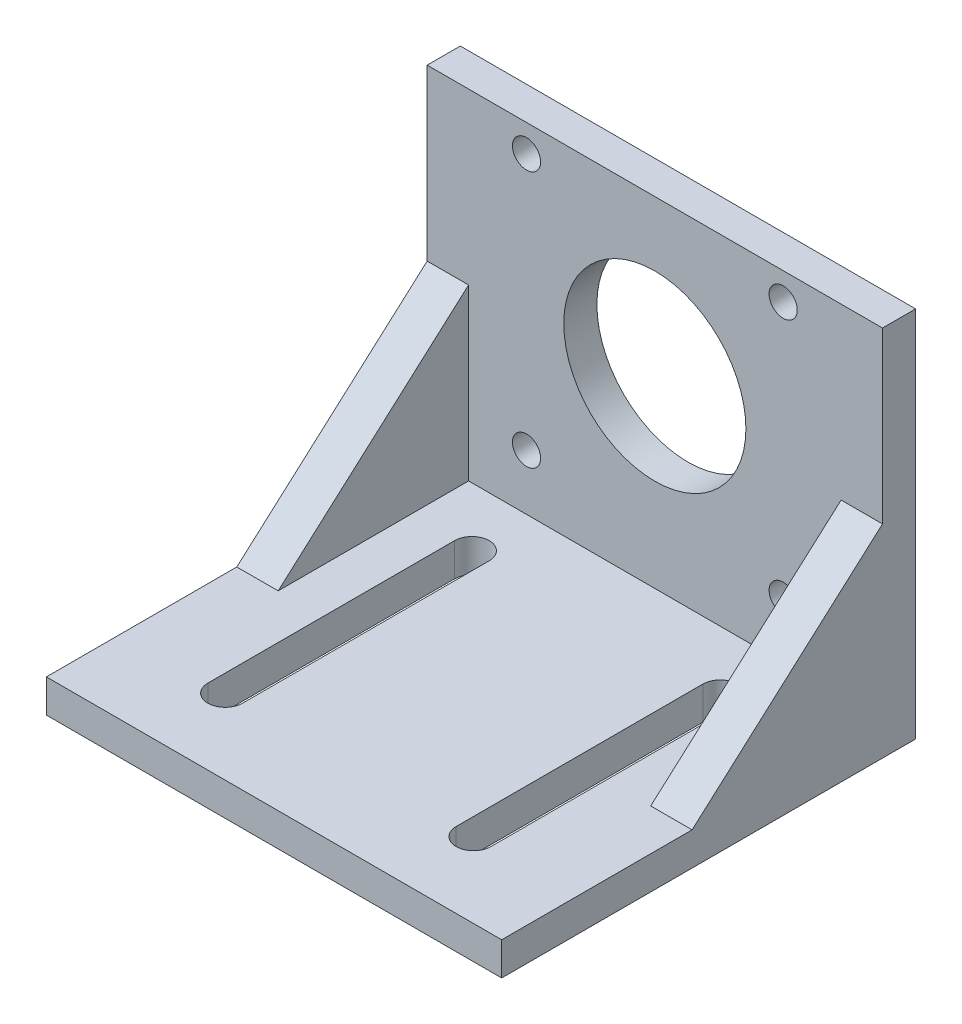
ISO-10303-21;
HEADER;
FILE_DESCRIPTION(('STEP AP214'),'2;1');
FILE_NAME('part.step','',(''),(''),'','','');
FILE_SCHEMA(('AUTOMOTIVE_DESIGN { 1 0 10303 214 1 1 1 1 }'));
ENDSEC;
DATA;
#1=APPLICATION_CONTEXT('core data for automotive mechanical design processes');
#2=APPLICATION_PROTOCOL_DEFINITION('international standard','automotive_design',2000,#1);
#3=PRODUCT_CONTEXT('',#1,'mechanical');
#4=PRODUCT('Part','Part','',(#3));
#5=PRODUCT_RELATED_PRODUCT_CATEGORY('part','',(#4));
#6=PRODUCT_DEFINITION_FORMATION('','',#4);
#7=PRODUCT_DEFINITION_CONTEXT('part definition',#1,'design');
#8=PRODUCT_DEFINITION('design','',#6,#7);
#9=PRODUCT_DEFINITION_SHAPE('','',#8);
#10=(LENGTH_UNIT() NAMED_UNIT(*) SI_UNIT(.MILLI.,.METRE.));
#11=(NAMED_UNIT(*) PLANE_ANGLE_UNIT() SI_UNIT($,.RADIAN.));
#12=(NAMED_UNIT(*) SI_UNIT($,.STERADIAN.) SOLID_ANGLE_UNIT());
#13=UNCERTAINTY_MEASURE_WITH_UNIT(LENGTH_MEASURE(1.E-05),#10,'distance_accuracy_value','');
#14=(GEOMETRIC_REPRESENTATION_CONTEXT(3) GLOBAL_UNCERTAINTY_ASSIGNED_CONTEXT((#13)) GLOBAL_UNIT_ASSIGNED_CONTEXT((#10,
#11,#12)) REPRESENTATION_CONTEXT('',''));
#15=CARTESIAN_POINT('',(0.,0.,0.));
#16=DIRECTION('',(0.,0.,1.));
#17=DIRECTION('',(1.,0.,0.));
#18=AXIS2_PLACEMENT_3D('',#15,#16,#17);
#19=CARTESIAN_POINT('',(27.5,45.,-46.));
#20=DIRECTION('',(0.,0.,-1.));
#21=DIRECTION('',(0.,1.,0.));
#22=AXIS2_PLACEMENT_3D('',#19,#20,#21);
#23=PLANE('',#22);
#24=CARTESIAN_POINT('',(0.,26.2168182757381,-46.));
#25=DIRECTION('',(0.,0.,1.));
#26=DIRECTION('',(1.,0.,0.));
#27=AXIS2_PLACEMENT_3D('',#24,#25,#26);
#28=CIRCLE('',#27,11.);
#29=CARTESIAN_POINT('',(11.,26.2168182757381,-46.));
#30=VERTEX_POINT('',#29);
#31=EDGE_CURVE('E197',#30,#30,#28,.T.);
#32=ORIENTED_EDGE('',*,*,#31,.F.);
#33=EDGE_LOOP('',(#32));
#34=FACE_BOUND('',#33,.T.);
#35=CARTESIAN_POINT('',(-15.5,10.7168182757381,-46.));
#36=DIRECTION('',(0.,0.,1.));
#37=DIRECTION('',(1.,0.,0.));
#38=AXIS2_PLACEMENT_3D('',#35,#36,#37);
#39=CIRCLE('',#38,1.7);
#40=CARTESIAN_POINT('',(-13.8,10.7168182757381,-46.));
#41=VERTEX_POINT('',#40);
#42=EDGE_CURVE('E190',#41,#41,#39,.T.);
#43=ORIENTED_EDGE('',*,*,#42,.F.);
#44=EDGE_LOOP('',(#43));
#45=FACE_BOUND('',#44,.T.);
#46=CARTESIAN_POINT('',(-15.5,41.7168182757381,-46.));
#47=DIRECTION('',(0.,0.,1.));
#48=DIRECTION('',(1.,0.,0.));
#49=AXIS2_PLACEMENT_3D('',#46,#47,#48);
#50=CIRCLE('',#49,1.7);
#51=CARTESIAN_POINT('',(-13.8,41.7168182757381,-46.));
#52=VERTEX_POINT('',#51);
#53=EDGE_CURVE('E198',#52,#52,#50,.T.);
#54=ORIENTED_EDGE('',*,*,#53,.F.);
#55=EDGE_LOOP('',(#54));
#56=FACE_BOUND('',#55,.T.);
#57=CARTESIAN_POINT('',(15.5,41.7168182757381,-46.));
#58=DIRECTION('',(0.,0.,1.));
#59=DIRECTION('',(1.,0.,0.));
#60=AXIS2_PLACEMENT_3D('',#57,#58,#59);
#61=CIRCLE('',#60,1.7);
#62=CARTESIAN_POINT('',(17.2,41.7168182757381,-46.));
#63=VERTEX_POINT('',#62);
#64=EDGE_CURVE('E204',#63,#63,#61,.T.);
#65=ORIENTED_EDGE('',*,*,#64,.F.);
#66=EDGE_LOOP('',(#65));
#67=FACE_BOUND('',#66,.T.);
#68=CARTESIAN_POINT('',(15.5,10.7168182757381,-46.));
#69=DIRECTION('',(0.,0.,1.));
#70=DIRECTION('',(1.,0.,0.));
#71=AXIS2_PLACEMENT_3D('',#68,#69,#70);
#72=CIRCLE('',#71,1.7);
#73=CARTESIAN_POINT('',(17.2,10.7168182757381,-46.));
#74=VERTEX_POINT('',#73);
#75=EDGE_CURVE('E188',#74,#74,#72,.T.);
#76=ORIENTED_EDGE('',*,*,#75,.F.);
#77=EDGE_LOOP('',(#76));
#78=FACE_BOUND('',#77,.T.);
#79=DIRECTION('',(-1.,0.,0.));
#80=VECTOR('',#79,1.);
#81=CARTESIAN_POINT('',(-22.5,24.5,-46.));
#82=LINE('',#81,#80);
#83=CARTESIAN_POINT('',(-22.5,24.5,-46.));
#84=VERTEX_POINT('',#83);
#85=CARTESIAN_POINT('',(-27.5,24.5,-46.));
#86=VERTEX_POINT('',#85);
#87=EDGE_CURVE('E50',#84,#86,#82,.T.);
#88=ORIENTED_EDGE('',*,*,#87,.F.);
#89=DIRECTION('',(0.,1.,0.));
#90=VECTOR('',#89,1.);
#91=CARTESIAN_POINT('',(-22.5,0.,-46.));
#92=LINE('',#91,#90);
#93=CARTESIAN_POINT('',(-22.5,4.00000000000001,-46.));
#94=VERTEX_POINT('',#93);
#95=EDGE_CURVE('E352',#94,#84,#92,.T.);
#96=ORIENTED_EDGE('',*,*,#95,.F.);
#97=DIRECTION('',(-1.,0.,0.));
#98=VECTOR('',#97,1.);
#99=CARTESIAN_POINT('',(27.5,4.00000000000001,-46.));
#100=LINE('',#99,#98);
#101=CARTESIAN_POINT('',(22.5,4.00000000000001,-46.));
#102=VERTEX_POINT('',#101);
#103=EDGE_CURVE('E180',#102,#94,#100,.T.);
#104=ORIENTED_EDGE('',*,*,#103,.F.);
#105=DIRECTION('',(0.,1.,0.));
#106=VECTOR('',#105,1.);
#107=CARTESIAN_POINT('',(22.5,4.00000000000001,-46.));
#108=LINE('',#107,#106);
#109=CARTESIAN_POINT('',(22.5,24.5,-46.));
#110=VERTEX_POINT('',#109);
#111=EDGE_CURVE('E175',#102,#110,#108,.T.);
#112=ORIENTED_EDGE('',*,*,#111,.T.);
#113=DIRECTION('',(1.,0.,0.));
#114=VECTOR('',#113,1.);
#115=CARTESIAN_POINT('',(22.5,24.5,-46.));
#116=LINE('',#115,#114);
#117=CARTESIAN_POINT('',(27.5,24.5,-46.));
#118=VERTEX_POINT('',#117);
#119=EDGE_CURVE('E160',#110,#118,#116,.T.);
#120=ORIENTED_EDGE('',*,*,#119,.T.);
#121=DIRECTION('',(0.,-1.,0.));
#122=VECTOR('',#121,1.);
#123=CARTESIAN_POINT('',(27.5,45.,-46.));
#124=LINE('',#123,#122);
#125=CARTESIAN_POINT('',(27.5,45.,-46.));
#126=VERTEX_POINT('',#125);
#127=EDGE_CURVE('E292',#126,#118,#124,.T.);
#128=ORIENTED_EDGE('',*,*,#127,.F.);
#129=DIRECTION('',(-1.,0.,0.));
#130=VECTOR('',#129,1.);
#131=CARTESIAN_POINT('',(27.5,45.,-46.));
#132=LINE('',#131,#130);
#133=CARTESIAN_POINT('',(-27.5,45.,-46.));
#134=VERTEX_POINT('',#133);
#135=EDGE_CURVE('E311',#126,#134,#132,.T.);
#136=ORIENTED_EDGE('',*,*,#135,.T.);
#137=DIRECTION('',(0.,-1.,0.));
#138=VECTOR('',#137,1.);
#139=CARTESIAN_POINT('',(-27.5,45.,-46.));
#140=LINE('',#139,#138);
#141=EDGE_CURVE('E305',#134,#86,#140,.T.);
#142=ORIENTED_EDGE('',*,*,#141,.T.);
#143=EDGE_LOOP('',(#88,#96,#104,#112,#120,#128,#136,#142));
#144=FACE_BOUND('',#143,.T.);
#145=ADVANCED_FACE('F35',(#34,#45,#56,#67,#78,#144),#23,.F.);
#146=CARTESIAN_POINT('',(27.5,4.00000000000001,-46.));
#147=DIRECTION('',(0.,-1.,0.));
#148=DIRECTION('',(0.,0.,-1.));
#149=AXIS2_PLACEMENT_3D('',#146,#147,#148);
#150=PLANE('',#149);
#151=DIRECTION('',(0.,0.,1.));
#152=VECTOR('',#151,1.);
#153=CARTESIAN_POINT('',(12.9,4.,-38.9));
#154=LINE('',#153,#152);
#155=CARTESIAN_POINT('',(12.9,4.,-38.9));
#156=VERTEX_POINT('',#155);
#157=CARTESIAN_POINT('',(12.9,4.,-9.1));
#158=VERTEX_POINT('',#157);
#159=EDGE_CURVE('E262',#156,#158,#154,.T.);
#160=ORIENTED_EDGE('',*,*,#159,.F.);
#161=CARTESIAN_POINT('',(15.,4.,-38.9));
#162=DIRECTION('',(0.,1.,0.));
#163=DIRECTION('',(0.,0.,1.));
#164=AXIS2_PLACEMENT_3D('',#161,#162,#163);
#165=CIRCLE('',#164,2.1);
#166=CARTESIAN_POINT('',(17.1,4.,-38.9));
#167=VERTEX_POINT('',#166);
#168=EDGE_CURVE('E260',#167,#156,#165,.T.);
#169=ORIENTED_EDGE('',*,*,#168,.F.);
#170=DIRECTION('',(0.,0.,-1.));
#171=VECTOR('',#170,1.);
#172=CARTESIAN_POINT('',(17.1,4.,-9.1));
#173=LINE('',#172,#171);
#174=CARTESIAN_POINT('',(17.1,4.,-9.1));
#175=VERTEX_POINT('',#174);
#176=EDGE_CURVE('E268',#175,#167,#173,.T.);
#177=ORIENTED_EDGE('',*,*,#176,.F.);
#178=CARTESIAN_POINT('',(15.,4.,-9.1));
#179=DIRECTION('',(0.,1.,0.));
#180=DIRECTION('',(0.,0.,1.));
#181=AXIS2_PLACEMENT_3D('',#178,#179,#180);
#182=CIRCLE('',#181,2.1);
#183=EDGE_CURVE('E265',#158,#175,#182,.T.);
#184=ORIENTED_EDGE('',*,*,#183,.F.);
#185=EDGE_LOOP('',(#160,#169,#177,#184));
#186=FACE_BOUND('',#185,.T.);
#187=DIRECTION('',(0.,0.,1.));
#188=VECTOR('',#187,1.);
#189=CARTESIAN_POINT('',(-17.1,4.,-38.9));
#190=LINE('',#189,#188);
#191=CARTESIAN_POINT('',(-17.1,4.,-38.9));
#192=VERTEX_POINT('',#191);
#193=CARTESIAN_POINT('',(-17.1,4.,-9.1));
#194=VERTEX_POINT('',#193);
#195=EDGE_CURVE('E231',#192,#194,#190,.T.);
#196=ORIENTED_EDGE('',*,*,#195,.F.);
#197=CARTESIAN_POINT('',(-15.,4.,-38.9));
#198=DIRECTION('',(0.,1.,0.));
#199=DIRECTION('',(0.,0.,1.));
#200=AXIS2_PLACEMENT_3D('',#197,#198,#199);
#201=CIRCLE('',#200,2.1);
#202=CARTESIAN_POINT('',(-12.9,4.,-38.9));
#203=VERTEX_POINT('',#202);
#204=EDGE_CURVE('E229',#203,#192,#201,.T.);
#205=ORIENTED_EDGE('',*,*,#204,.F.);
#206=DIRECTION('',(0.,0.,-1.));
#207=VECTOR('',#206,1.);
#208=CARTESIAN_POINT('',(-12.9,4.,-9.1));
#209=LINE('',#208,#207);
#210=CARTESIAN_POINT('',(-12.9,4.,-9.1));
#211=VERTEX_POINT('',#210);
#212=EDGE_CURVE('E237',#211,#203,#209,.T.);
#213=ORIENTED_EDGE('',*,*,#212,.F.);
#214=CARTESIAN_POINT('',(-15.,4.,-9.1));
#215=DIRECTION('',(0.,1.,0.));
#216=DIRECTION('',(0.,0.,1.));
#217=AXIS2_PLACEMENT_3D('',#214,#215,#216);
#218=CIRCLE('',#217,2.1);
#219=EDGE_CURVE('E234',#194,#211,#218,.T.);
#220=ORIENTED_EDGE('',*,*,#219,.F.);
#221=EDGE_LOOP('',(#196,#205,#213,#220));
#222=FACE_BOUND('',#221,.T.);
#223=DIRECTION('',(-1.,0.,0.));
#224=VECTOR('',#223,1.);
#225=CARTESIAN_POINT('',(-22.5,4.,-23.));
#226=LINE('',#225,#224);
#227=CARTESIAN_POINT('',(-22.5,4.,-23.));
#228=VERTEX_POINT('',#227);
#229=CARTESIAN_POINT('',(-27.5,4.,-23.));
#230=VERTEX_POINT('',#229);
#231=EDGE_CURVE('E182',#228,#230,#226,.T.);
#232=ORIENTED_EDGE('',*,*,#231,.T.);
#233=DIRECTION('',(0.,0.,1.));
#234=VECTOR('',#233,1.);
#235=CARTESIAN_POINT('',(-27.5,4.00000000000001,-46.));
#236=LINE('',#235,#234);
#237=CARTESIAN_POINT('',(-27.5,4.,0.));
#238=VERTEX_POINT('',#237);
#239=EDGE_CURVE('E286',#230,#238,#236,.T.);
#240=ORIENTED_EDGE('',*,*,#239,.T.);
#241=DIRECTION('',(-1.,0.,0.));
#242=VECTOR('',#241,1.);
#243=CARTESIAN_POINT('',(27.5,4.,0.));
#244=LINE('',#243,#242);
#245=CARTESIAN_POINT('',(27.5,4.,0.));
#246=VERTEX_POINT('',#245);
#247=EDGE_CURVE('E296',#246,#238,#244,.T.);
#248=ORIENTED_EDGE('',*,*,#247,.F.);
#249=DIRECTION('',(0.,0.,1.));
#250=VECTOR('',#249,1.);
#251=CARTESIAN_POINT('',(27.5,4.00000000000001,-46.));
#252=LINE('',#251,#250);
#253=CARTESIAN_POINT('',(27.5,4.,-23.));
#254=VERTEX_POINT('',#253);
#255=EDGE_CURVE('E294',#254,#246,#252,.T.);
#256=ORIENTED_EDGE('',*,*,#255,.F.);
#257=DIRECTION('',(1.,0.,0.));
#258=VECTOR('',#257,1.);
#259=CARTESIAN_POINT('',(22.5,4.,-23.));
#260=LINE('',#259,#258);
#261=CARTESIAN_POINT('',(22.5,4.,-23.));
#262=VERTEX_POINT('',#261);
#263=EDGE_CURVE('E170',#262,#254,#260,.T.);
#264=ORIENTED_EDGE('',*,*,#263,.F.);
#265=DIRECTION('',(0.,0.,-1.));
#266=VECTOR('',#265,1.);
#267=CARTESIAN_POINT('',(22.5,4.,-23.));
#268=LINE('',#267,#266);
#269=EDGE_CURVE('E171',#262,#102,#268,.T.);
#270=ORIENTED_EDGE('',*,*,#269,.T.);
#271=ORIENTED_EDGE('',*,*,#103,.T.);
#272=DIRECTION('',(0.,0.,-1.));
#273=VECTOR('',#272,1.);
#274=CARTESIAN_POINT('',(-22.5,4.,0.));
#275=LINE('',#274,#273);
#276=EDGE_CURVE('E58',#228,#94,#275,.T.);
#277=ORIENTED_EDGE('',*,*,#276,.F.);
#278=EDGE_LOOP('',(#232,#240,#248,#256,#264,#270,#271,#277));
#279=FACE_BOUND('',#278,.T.);
#280=ADVANCED_FACE('F363',(#186,#222,#279),#150,.F.);
#281=CARTESIAN_POINT('',(27.5,4.,0.));
#282=DIRECTION('',(0.,0.,-1.));
#283=DIRECTION('',(0.,1.,0.));
#284=AXIS2_PLACEMENT_3D('',#281,#282,#283);
#285=PLANE('',#284);
#286=DIRECTION('',(0.,-1.,0.));
#287=VECTOR('',#286,1.);
#288=CARTESIAN_POINT('',(-27.5,4.,0.));
#289=LINE('',#288,#287);
#290=CARTESIAN_POINT('',(-27.5,0.,0.));
#291=VERTEX_POINT('',#290);
#292=EDGE_CURVE('E252',#238,#291,#289,.T.);
#293=ORIENTED_EDGE('',*,*,#292,.T.);
#294=DIRECTION('',(-1.,0.,0.));
#295=VECTOR('',#294,1.);
#296=CARTESIAN_POINT('',(27.5,0.,0.));
#297=LINE('',#296,#295);
#298=CARTESIAN_POINT('',(27.5,0.,0.));
#299=VERTEX_POINT('',#298);
#300=EDGE_CURVE('E11',#299,#291,#297,.T.);
#301=ORIENTED_EDGE('',*,*,#300,.F.);
#302=DIRECTION('',(0.,-1.,0.));
#303=VECTOR('',#302,1.);
#304=CARTESIAN_POINT('',(27.5,4.,0.));
#305=LINE('',#304,#303);
#306=EDGE_CURVE('E282',#246,#299,#305,.T.);
#307=ORIENTED_EDGE('',*,*,#306,.F.);
#308=ORIENTED_EDGE('',*,*,#247,.T.);
#309=EDGE_LOOP('',(#293,#301,#307,#308));
#310=FACE_BOUND('',#309,.T.);
#311=ADVANCED_FACE('F37',(#310),#285,.F.);
#312=CARTESIAN_POINT('',(27.5,0.,0.));
#313=DIRECTION('',(0.,1.,0.));
#314=DIRECTION('',(0.,0.,1.));
#315=AXIS2_PLACEMENT_3D('',#312,#313,#314);
#316=PLANE('',#315);
#317=DIRECTION('',(0.,0.,1.));
#318=VECTOR('',#317,1.);
#319=CARTESIAN_POINT('',(-12.9,0.,-9.1));
#320=LINE('',#319,#318);
#321=CARTESIAN_POINT('',(-12.9,0.,-38.9));
#322=VERTEX_POINT('',#321);
#323=CARTESIAN_POINT('',(-12.9,0.,-9.1));
#324=VERTEX_POINT('',#323);
#325=EDGE_CURVE('E222',#322,#324,#320,.T.);
#326=ORIENTED_EDGE('',*,*,#325,.F.);
#327=CARTESIAN_POINT('',(-15.,0.,-38.9));
#328=DIRECTION('',(0.,1.,0.));
#329=DIRECTION('',(0.,0.,1.));
#330=AXIS2_PLACEMENT_3D('',#327,#328,#329);
#331=CIRCLE('',#330,2.1);
#332=CARTESIAN_POINT('',(-17.1,0.,-38.9));
#333=VERTEX_POINT('',#332);
#334=EDGE_CURVE('E226',#333,#322,#331,.F.);
#335=ORIENTED_EDGE('',*,*,#334,.F.);
#336=DIRECTION('',(0.,0.,-1.));
#337=VECTOR('',#336,1.);
#338=CARTESIAN_POINT('',(-17.1,0.,-38.9));
#339=LINE('',#338,#337);
#340=CARTESIAN_POINT('',(-17.1,0.,-9.1));
#341=VERTEX_POINT('',#340);
#342=EDGE_CURVE('E243',#341,#333,#339,.T.);
#343=ORIENTED_EDGE('',*,*,#342,.F.);
#344=CARTESIAN_POINT('',(-15.,0.,-9.1));
#345=DIRECTION('',(0.,1.,0.));
#346=DIRECTION('',(0.,0.,1.));
#347=AXIS2_PLACEMENT_3D('',#344,#345,#346);
#348=CIRCLE('',#347,2.1);
#349=EDGE_CURVE('E220',#324,#341,#348,.F.);
#350=ORIENTED_EDGE('',*,*,#349,.F.);
#351=EDGE_LOOP('',(#326,#335,#343,#350));
#352=FACE_BOUND('',#351,.T.);
#353=DIRECTION('',(0.,0.,1.));
#354=VECTOR('',#353,1.);
#355=CARTESIAN_POINT('',(17.1,0.,-9.1));
#356=LINE('',#355,#354);
#357=CARTESIAN_POINT('',(17.1,0.,-38.9));
#358=VERTEX_POINT('',#357);
#359=CARTESIAN_POINT('',(17.1,0.,-9.1));
#360=VERTEX_POINT('',#359);
#361=EDGE_CURVE('E254',#358,#360,#356,.T.);
#362=ORIENTED_EDGE('',*,*,#361,.F.);
#363=CARTESIAN_POINT('',(15.,0.,-38.9));
#364=DIRECTION('',(0.,1.,0.));
#365=DIRECTION('',(0.,0.,1.));
#366=AXIS2_PLACEMENT_3D('',#363,#364,#365);
#367=CIRCLE('',#366,2.1);
#368=CARTESIAN_POINT('',(12.9,0.,-38.9));
#369=VERTEX_POINT('',#368);
#370=EDGE_CURVE('E257',#369,#358,#367,.F.);
#371=ORIENTED_EDGE('',*,*,#370,.F.);
#372=DIRECTION('',(0.,0.,-1.));
#373=VECTOR('',#372,1.);
#374=CARTESIAN_POINT('',(12.9,0.,-38.9));
#375=LINE('',#374,#373);
#376=CARTESIAN_POINT('',(12.9,0.,-9.1));
#377=VERTEX_POINT('',#376);
#378=EDGE_CURVE('E223',#377,#369,#375,.T.);
#379=ORIENTED_EDGE('',*,*,#378,.F.);
#380=CARTESIAN_POINT('',(15.,0.,-9.1));
#381=DIRECTION('',(0.,1.,0.));
#382=DIRECTION('',(0.,0.,1.));
#383=AXIS2_PLACEMENT_3D('',#380,#381,#382);
#384=CIRCLE('',#383,2.1);
#385=EDGE_CURVE('E219',#360,#377,#384,.F.);
#386=ORIENTED_EDGE('',*,*,#385,.F.);
#387=EDGE_LOOP('',(#362,#371,#379,#386));
#388=FACE_BOUND('',#387,.T.);
#389=DIRECTION('',(0.,0.,-1.));
#390=VECTOR('',#389,1.);
#391=CARTESIAN_POINT('',(-27.5,0.,0.));
#392=LINE('',#391,#390);
#393=CARTESIAN_POINT('',(-27.5,0.,-50.));
#394=VERTEX_POINT('',#393);
#395=EDGE_CURVE('E299',#291,#394,#392,.T.);
#396=ORIENTED_EDGE('',*,*,#395,.T.);
#397=DIRECTION('',(-1.,0.,0.));
#398=VECTOR('',#397,1.);
#399=CARTESIAN_POINT('',(27.5,0.,-50.));
#400=LINE('',#399,#398);
#401=CARTESIAN_POINT('',(27.5,0.,-50.));
#402=VERTEX_POINT('',#401);
#403=EDGE_CURVE('E43',#402,#394,#400,.T.);
#404=ORIENTED_EDGE('',*,*,#403,.F.);
#405=DIRECTION('',(0.,0.,-1.));
#406=VECTOR('',#405,1.);
#407=CARTESIAN_POINT('',(27.5,0.,0.));
#408=LINE('',#407,#406);
#409=EDGE_CURVE('E285',#299,#402,#408,.T.);
#410=ORIENTED_EDGE('',*,*,#409,.F.);
#411=ORIENTED_EDGE('',*,*,#300,.T.);
#412=EDGE_LOOP('',(#396,#404,#410,#411));
#413=FACE_BOUND('',#412,.T.);
#414=ADVANCED_FACE('F339',(#352,#388,#413),#316,.F.);
#415=CARTESIAN_POINT('',(27.5,0.,-50.));
#416=DIRECTION('',(0.,0.,1.));
#417=DIRECTION('',(1.,0.,0.));
#418=AXIS2_PLACEMENT_3D('',#415,#416,#417);
#419=PLANE('',#418);
#420=CARTESIAN_POINT('',(15.5,10.7168182757381,-50.));
#421=DIRECTION('',(0.,0.,1.));
#422=DIRECTION('',(1.,0.,0.));
#423=AXIS2_PLACEMENT_3D('',#420,#421,#422);
#424=CIRCLE('',#423,1.7);
#425=CARTESIAN_POINT('',(17.2,10.7168182757381,-50.));
#426=VERTEX_POINT('',#425);
#427=EDGE_CURVE('E207',#426,#426,#424,.F.);
#428=ORIENTED_EDGE('',*,*,#427,.F.);
#429=EDGE_LOOP('',(#428));
#430=FACE_BOUND('',#429,.T.);
#431=CARTESIAN_POINT('',(15.5,41.7168182757381,-50.));
#432=DIRECTION('',(0.,0.,1.));
#433=DIRECTION('',(1.,0.,0.));
#434=AXIS2_PLACEMENT_3D('',#431,#432,#433);
#435=CIRCLE('',#434,1.7);
#436=CARTESIAN_POINT('',(17.2,41.7168182757381,-50.));
#437=VERTEX_POINT('',#436);
#438=EDGE_CURVE('E201',#437,#437,#435,.F.);
#439=ORIENTED_EDGE('',*,*,#438,.F.);
#440=EDGE_LOOP('',(#439));
#441=FACE_BOUND('',#440,.T.);
#442=CARTESIAN_POINT('',(-15.5,41.7168182757381,-50.));
#443=DIRECTION('',(0.,0.,1.));
#444=DIRECTION('',(1.,0.,0.));
#445=AXIS2_PLACEMENT_3D('',#442,#443,#444);
#446=CIRCLE('',#445,1.7);
#447=CARTESIAN_POINT('',(-13.8,41.7168182757381,-50.));
#448=VERTEX_POINT('',#447);
#449=EDGE_CURVE('E194',#448,#448,#446,.F.);
#450=ORIENTED_EDGE('',*,*,#449,.F.);
#451=EDGE_LOOP('',(#450));
#452=FACE_BOUND('',#451,.T.);
#453=CARTESIAN_POINT('',(-15.5,10.7168182757381,-50.));
#454=DIRECTION('',(0.,0.,1.));
#455=DIRECTION('',(1.,0.,0.));
#456=AXIS2_PLACEMENT_3D('',#453,#454,#455);
#457=CIRCLE('',#456,1.7);
#458=CARTESIAN_POINT('',(-13.8,10.7168182757381,-50.));
#459=VERTEX_POINT('',#458);
#460=EDGE_CURVE('E193',#459,#459,#457,.F.);
#461=ORIENTED_EDGE('',*,*,#460,.F.);
#462=EDGE_LOOP('',(#461));
#463=FACE_BOUND('',#462,.T.);
#464=CARTESIAN_POINT('',(0.,26.2168182757381,-50.));
#465=DIRECTION('',(0.,0.,1.));
#466=DIRECTION('',(1.,0.,0.));
#467=AXIS2_PLACEMENT_3D('',#464,#465,#466);
#468=CIRCLE('',#467,11.);
#469=CARTESIAN_POINT('',(11.,26.2168182757381,-50.));
#470=VERTEX_POINT('',#469);
#471=EDGE_CURVE('E216',#470,#470,#468,.F.);
#472=ORIENTED_EDGE('',*,*,#471,.F.);
#473=EDGE_LOOP('',(#472));
#474=FACE_BOUND('',#473,.T.);
#475=DIRECTION('',(0.,1.,0.));
#476=VECTOR('',#475,1.);
#477=CARTESIAN_POINT('',(-27.5,0.,-50.));
#478=LINE('',#477,#476);
#479=CARTESIAN_POINT('',(-27.5,45.,-50.));
#480=VERTEX_POINT('',#479);
#481=EDGE_CURVE('E301',#394,#480,#478,.T.);
#482=ORIENTED_EDGE('',*,*,#481,.T.);
#483=DIRECTION('',(-1.,0.,0.));
#484=VECTOR('',#483,1.);
#485=CARTESIAN_POINT('',(27.5,45.,-50.));
#486=LINE('',#485,#484);
#487=CARTESIAN_POINT('',(27.5,45.,-50.));
#488=VERTEX_POINT('',#487);
#489=EDGE_CURVE('E314',#488,#480,#486,.T.);
#490=ORIENTED_EDGE('',*,*,#489,.F.);
#491=DIRECTION('',(0.,1.,0.));
#492=VECTOR('',#491,1.);
#493=CARTESIAN_POINT('',(27.5,0.,-50.));
#494=LINE('',#493,#492);
#495=EDGE_CURVE('E288',#402,#488,#494,.T.);
#496=ORIENTED_EDGE('',*,*,#495,.F.);
#497=ORIENTED_EDGE('',*,*,#403,.T.);
#498=EDGE_LOOP('',(#482,#490,#496,#497));
#499=FACE_BOUND('',#498,.T.);
#500=ADVANCED_FACE('F321',(#430,#441,#452,#463,#474,#499),#419,.F.);
#501=CARTESIAN_POINT('',(27.5,45.,-50.));
#502=DIRECTION('',(0.,-1.,0.));
#503=DIRECTION('',(0.,0.,-1.));
#504=AXIS2_PLACEMENT_3D('',#501,#502,#503);
#505=PLANE('',#504);
#506=DIRECTION('',(0.,0.,1.));
#507=VECTOR('',#506,1.);
#508=CARTESIAN_POINT('',(-27.5,45.,-50.));
#509=LINE('',#508,#507);
#510=EDGE_CURVE('E303',#480,#134,#509,.T.);
#511=ORIENTED_EDGE('',*,*,#510,.T.);
#512=ORIENTED_EDGE('',*,*,#135,.F.);
#513=DIRECTION('',(0.,0.,1.));
#514=VECTOR('',#513,1.);
#515=CARTESIAN_POINT('',(27.5,45.,-50.));
#516=LINE('',#515,#514);
#517=EDGE_CURVE('E290',#488,#126,#516,.T.);
#518=ORIENTED_EDGE('',*,*,#517,.F.);
#519=ORIENTED_EDGE('',*,*,#489,.T.);
#520=EDGE_LOOP('',(#511,#512,#518,#519));
#521=FACE_BOUND('',#520,.T.);
#522=ADVANCED_FACE('F333',(#521),#505,.F.);
#523=CARTESIAN_POINT('',(27.5,0.,0.));
#524=DIRECTION('',(1.,0.,0.));
#525=DIRECTION('',(0.,0.,-1.));
#526=AXIS2_PLACEMENT_3D('',#523,#524,#525);
#527=PLANE('',#526);
#528=ORIENTED_EDGE('',*,*,#127,.T.);
#529=DIRECTION('',(0.,-0.665370524754448,0.746513271675722));
#530=VECTOR('',#529,1.);
#531=CARTESIAN_POINT('',(27.5,24.5,-46.));
#532=LINE('',#531,#530);
#533=EDGE_CURVE('E166',#118,#254,#532,.T.);
#534=ORIENTED_EDGE('',*,*,#533,.T.);
#535=ORIENTED_EDGE('',*,*,#255,.T.);
#536=ORIENTED_EDGE('',*,*,#306,.T.);
#537=ORIENTED_EDGE('',*,*,#409,.T.);
#538=ORIENTED_EDGE('',*,*,#495,.T.);
#539=ORIENTED_EDGE('',*,*,#517,.T.);
#540=EDGE_LOOP('',(#528,#534,#535,#536,#537,#538,#539));
#541=FACE_BOUND('',#540,.T.);
#542=ADVANCED_FACE('F336',(#541),#527,.T.);
#543=CARTESIAN_POINT('',(-27.5,0.,0.));
#544=DIRECTION('',(1.,0.,0.));
#545=DIRECTION('',(0.,0.,-1.));
#546=AXIS2_PLACEMENT_3D('',#543,#544,#545);
#547=PLANE('',#546);
#548=ORIENTED_EDGE('',*,*,#239,.F.);
#549=DIRECTION('',(0.,-0.665370524754448,0.746513271675722));
#550=VECTOR('',#549,1.);
#551=CARTESIAN_POINT('',(-27.5,-9.19515406900185,-8.19568080063208));
#552=LINE('',#551,#550);
#553=EDGE_CURVE('E343',#86,#230,#552,.T.);
#554=ORIENTED_EDGE('',*,*,#553,.F.);
#555=ORIENTED_EDGE('',*,*,#141,.F.);
#556=ORIENTED_EDGE('',*,*,#510,.F.);
#557=ORIENTED_EDGE('',*,*,#481,.F.);
#558=ORIENTED_EDGE('',*,*,#395,.F.);
#559=ORIENTED_EDGE('',*,*,#292,.F.);
#560=EDGE_LOOP('',(#548,#554,#555,#556,#557,#558,#559));
#561=FACE_BOUND('',#560,.T.);
#562=ADVANCED_FACE('F327',(#561),#547,.F.);
#563=CARTESIAN_POINT('',(15.,-0.001000000000001,-38.9));
#564=DIRECTION('',(0.,1.,0.));
#565=DIRECTION('',(0.,0.,1.));
#566=AXIS2_PLACEMENT_3D('',#563,#564,#565);
#567=CYLINDRICAL_SURFACE('',#566,2.1);
#568=ORIENTED_EDGE('',*,*,#370,.T.);
#569=DIRECTION('',(0.,1.,0.));
#570=VECTOR('',#569,1.);
#571=CARTESIAN_POINT('',(17.1,-0.001000000000001,-38.9));
#572=LINE('',#571,#570);
#573=EDGE_CURVE('E272',#358,#167,#572,.T.);
#574=ORIENTED_EDGE('',*,*,#573,.T.);
#575=ORIENTED_EDGE('',*,*,#168,.T.);
#576=DIRECTION('',(0.,1.,0.));
#577=VECTOR('',#576,1.);
#578=CARTESIAN_POINT('',(12.9,-0.001000000000001,-38.9));
#579=LINE('',#578,#577);
#580=EDGE_CURVE('E271',#369,#156,#579,.T.);
#581=ORIENTED_EDGE('',*,*,#580,.F.);
#582=EDGE_LOOP('',(#568,#574,#575,#581));
#583=FACE_BOUND('',#582,.T.);
#584=ADVANCED_FACE('F397',(#583),#567,.F.);
#585=CARTESIAN_POINT('',(17.1,-0.00100000000000447,-9.1));
#586=DIRECTION('',(1.,0.,0.));
#587=DIRECTION('',(0.,0.,-1.));
#588=AXIS2_PLACEMENT_3D('',#585,#586,#587);
#589=PLANE('',#588);
#590=ORIENTED_EDGE('',*,*,#361,.T.);
#591=DIRECTION('',(0.,1.,0.));
#592=VECTOR('',#591,1.);
#593=CARTESIAN_POINT('',(17.1,-0.00100000000000447,-9.1));
#594=LINE('',#593,#592);
#595=EDGE_CURVE('E274',#360,#175,#594,.T.);
#596=ORIENTED_EDGE('',*,*,#595,.T.);
#597=ORIENTED_EDGE('',*,*,#176,.T.);
#598=ORIENTED_EDGE('',*,*,#573,.F.);
#599=EDGE_LOOP('',(#590,#596,#597,#598));
#600=FACE_BOUND('',#599,.T.);
#601=ADVANCED_FACE('F393',(#600),#589,.F.);
#602=CARTESIAN_POINT('',(15.,-0.00100000000000447,-9.1));
#603=DIRECTION('',(0.,1.,0.));
#604=DIRECTION('',(0.,0.,1.));
#605=AXIS2_PLACEMENT_3D('',#602,#603,#604);
#606=CYLINDRICAL_SURFACE('',#605,2.1);
#607=ORIENTED_EDGE('',*,*,#385,.T.);
#608=DIRECTION('',(0.,1.,0.));
#609=VECTOR('',#608,1.);
#610=CARTESIAN_POINT('',(12.9,-0.00100000000000447,-9.1));
#611=LINE('',#610,#609);
#612=EDGE_CURVE('E276',#377,#158,#611,.T.);
#613=ORIENTED_EDGE('',*,*,#612,.T.);
#614=ORIENTED_EDGE('',*,*,#183,.T.);
#615=ORIENTED_EDGE('',*,*,#595,.F.);
#616=EDGE_LOOP('',(#607,#613,#614,#615));
#617=FACE_BOUND('',#616,.T.);
#618=ADVANCED_FACE('F404',(#617),#606,.F.);
#619=CARTESIAN_POINT('',(12.9,-0.001000000000001,-38.9));
#620=DIRECTION('',(-1.,0.,0.));
#621=DIRECTION('',(0.,0.,1.));
#622=AXIS2_PLACEMENT_3D('',#619,#620,#621);
#623=PLANE('',#622);
#624=ORIENTED_EDGE('',*,*,#378,.T.);
#625=ORIENTED_EDGE('',*,*,#580,.T.);
#626=ORIENTED_EDGE('',*,*,#159,.T.);
#627=ORIENTED_EDGE('',*,*,#612,.F.);
#628=EDGE_LOOP('',(#624,#625,#626,#627));
#629=FACE_BOUND('',#628,.T.);
#630=ADVANCED_FACE('F401',(#629),#623,.F.);
#631=CARTESIAN_POINT('',(-15.,-0.001000000000001,-38.9));
#632=DIRECTION('',(0.,1.,0.));
#633=DIRECTION('',(0.,0.,1.));
#634=AXIS2_PLACEMENT_3D('',#631,#632,#633);
#635=CYLINDRICAL_SURFACE('',#634,2.1);
#636=ORIENTED_EDGE('',*,*,#334,.T.);
#637=DIRECTION('',(0.,1.,0.));
#638=VECTOR('',#637,1.);
#639=CARTESIAN_POINT('',(-12.9,-0.001000000000001,-38.9));
#640=LINE('',#639,#638);
#641=EDGE_CURVE('E241',#322,#203,#640,.T.);
#642=ORIENTED_EDGE('',*,*,#641,.T.);
#643=ORIENTED_EDGE('',*,*,#204,.T.);
#644=DIRECTION('',(0.,1.,0.));
#645=VECTOR('',#644,1.);
#646=CARTESIAN_POINT('',(-17.1,-0.001000000000001,-38.9));
#647=LINE('',#646,#645);
#648=EDGE_CURVE('E240',#333,#192,#647,.T.);
#649=ORIENTED_EDGE('',*,*,#648,.F.);
#650=EDGE_LOOP('',(#636,#642,#643,#649));
#651=FACE_BOUND('',#650,.T.);
#652=ADVANCED_FACE('F415',(#651),#635,.F.);
#653=CARTESIAN_POINT('',(-12.9,-0.00100000000000447,-9.1));
#654=DIRECTION('',(1.,0.,0.));
#655=DIRECTION('',(0.,0.,-1.));
#656=AXIS2_PLACEMENT_3D('',#653,#654,#655);
#657=PLANE('',#656);
#658=ORIENTED_EDGE('',*,*,#325,.T.);
#659=DIRECTION('',(0.,1.,0.));
#660=VECTOR('',#659,1.);
#661=CARTESIAN_POINT('',(-12.9,-0.00100000000000447,-9.1));
#662=LINE('',#661,#660);
#663=EDGE_CURVE('E244',#324,#211,#662,.T.);
#664=ORIENTED_EDGE('',*,*,#663,.T.);
#665=ORIENTED_EDGE('',*,*,#212,.T.);
#666=ORIENTED_EDGE('',*,*,#641,.F.);
#667=EDGE_LOOP('',(#658,#664,#665,#666));
#668=FACE_BOUND('',#667,.T.);
#669=ADVANCED_FACE('F417',(#668),#657,.F.);
#670=CARTESIAN_POINT('',(-15.,-0.00100000000000447,-9.1));
#671=DIRECTION('',(0.,1.,0.));
#672=DIRECTION('',(0.,0.,1.));
#673=AXIS2_PLACEMENT_3D('',#670,#671,#672);
#674=CYLINDRICAL_SURFACE('',#673,2.1);
#675=ORIENTED_EDGE('',*,*,#349,.T.);
#676=DIRECTION('',(0.,1.,0.));
#677=VECTOR('',#676,1.);
#678=CARTESIAN_POINT('',(-17.1,-0.00100000000000447,-9.1));
#679=LINE('',#678,#677);
#680=EDGE_CURVE('E246',#341,#194,#679,.T.);
#681=ORIENTED_EDGE('',*,*,#680,.T.);
#682=ORIENTED_EDGE('',*,*,#219,.T.);
#683=ORIENTED_EDGE('',*,*,#663,.F.);
#684=EDGE_LOOP('',(#675,#681,#682,#683));
#685=FACE_BOUND('',#684,.T.);
#686=ADVANCED_FACE('F419',(#685),#674,.F.);
#687=CARTESIAN_POINT('',(-17.1,-0.001000000000001,-38.9));
#688=DIRECTION('',(-1.,0.,0.));
#689=DIRECTION('',(0.,0.,1.));
#690=AXIS2_PLACEMENT_3D('',#687,#688,#689);
#691=PLANE('',#690);
#692=ORIENTED_EDGE('',*,*,#342,.T.);
#693=ORIENTED_EDGE('',*,*,#648,.T.);
#694=ORIENTED_EDGE('',*,*,#195,.T.);
#695=ORIENTED_EDGE('',*,*,#680,.F.);
#696=EDGE_LOOP('',(#692,#693,#694,#695));
#697=FACE_BOUND('',#696,.T.);
#698=ADVANCED_FACE('F412',(#697),#691,.F.);
#699=CARTESIAN_POINT('',(0.,26.2168182757381,-50.001));
#700=DIRECTION('',(0.,0.,1.));
#701=DIRECTION('',(1.,0.,0.));
#702=AXIS2_PLACEMENT_3D('',#699,#700,#701);
#703=CYLINDRICAL_SURFACE('',#702,11.);
#704=ORIENTED_EDGE('',*,*,#31,.T.);
#705=EDGE_LOOP('',(#704));
#706=FACE_BOUND('',#705,.T.);
#707=ORIENTED_EDGE('',*,*,#471,.T.);
#708=EDGE_LOOP('',(#707));
#709=FACE_BOUND('',#708,.T.);
#710=ADVANCED_FACE('F426',(#706,#709),#703,.F.);
#711=CARTESIAN_POINT('',(-15.5,10.7168182757381,-50.001));
#712=DIRECTION('',(0.,0.,1.));
#713=DIRECTION('',(1.,0.,0.));
#714=AXIS2_PLACEMENT_3D('',#711,#712,#713);
#715=CYLINDRICAL_SURFACE('',#714,1.7);
#716=ORIENTED_EDGE('',*,*,#42,.T.);
#717=EDGE_LOOP('',(#716));
#718=FACE_BOUND('',#717,.T.);
#719=ORIENTED_EDGE('',*,*,#460,.T.);
#720=EDGE_LOOP('',(#719));
#721=FACE_BOUND('',#720,.T.);
#722=ADVANCED_FACE('F502',(#718,#721),#715,.F.);
#723=CARTESIAN_POINT('',(-15.5,41.7168182757381,-50.001));
#724=DIRECTION('',(0.,0.,1.));
#725=DIRECTION('',(1.,0.,0.));
#726=AXIS2_PLACEMENT_3D('',#723,#724,#725);
#727=CYLINDRICAL_SURFACE('',#726,1.7);
#728=ORIENTED_EDGE('',*,*,#53,.T.);
#729=EDGE_LOOP('',(#728));
#730=FACE_BOUND('',#729,.T.);
#731=ORIENTED_EDGE('',*,*,#449,.T.);
#732=EDGE_LOOP('',(#731));
#733=FACE_BOUND('',#732,.T.);
#734=ADVANCED_FACE('F512',(#730,#733),#727,.F.);
#735=CARTESIAN_POINT('',(15.5,41.7168182757381,-50.001));
#736=DIRECTION('',(0.,0.,1.));
#737=DIRECTION('',(1.,0.,0.));
#738=AXIS2_PLACEMENT_3D('',#735,#736,#737);
#739=CYLINDRICAL_SURFACE('',#738,1.7);
#740=ORIENTED_EDGE('',*,*,#64,.T.);
#741=EDGE_LOOP('',(#740));
#742=FACE_BOUND('',#741,.T.);
#743=ORIENTED_EDGE('',*,*,#438,.T.);
#744=EDGE_LOOP('',(#743));
#745=FACE_BOUND('',#744,.T.);
#746=ADVANCED_FACE('F523',(#742,#745),#739,.F.);
#747=CARTESIAN_POINT('',(15.5,10.7168182757381,-50.001));
#748=DIRECTION('',(0.,0.,1.));
#749=DIRECTION('',(1.,0.,0.));
#750=AXIS2_PLACEMENT_3D('',#747,#748,#749);
#751=CYLINDRICAL_SURFACE('',#750,1.7);
#752=ORIENTED_EDGE('',*,*,#75,.T.);
#753=EDGE_LOOP('',(#752));
#754=FACE_BOUND('',#753,.T.);
#755=ORIENTED_EDGE('',*,*,#427,.T.);
#756=EDGE_LOOP('',(#755));
#757=FACE_BOUND('',#756,.T.);
#758=ADVANCED_FACE('F534',(#754,#757),#751,.F.);
#759=CARTESIAN_POINT('',(22.5,24.5,-46.));
#760=DIRECTION('',(0.,0.746513271675722,0.665370524754448));
#761=DIRECTION('',(0.,-0.665370524754448,0.746513271675722));
#762=AXIS2_PLACEMENT_3D('',#759,#760,#761);
#763=PLANE('',#762);
#764=ORIENTED_EDGE('',*,*,#533,.F.);
#765=ORIENTED_EDGE('',*,*,#119,.F.);
#766=DIRECTION('',(0.,-0.665370524754448,0.746513271675722));
#767=VECTOR('',#766,1.);
#768=CARTESIAN_POINT('',(22.5,24.5,-46.));
#769=LINE('',#768,#767);
#770=EDGE_CURVE('E164',#110,#262,#769,.T.);
#771=ORIENTED_EDGE('',*,*,#770,.T.);
#772=ORIENTED_EDGE('',*,*,#263,.T.);
#773=EDGE_LOOP('',(#764,#765,#771,#772));
#774=FACE_BOUND('',#773,.T.);
#775=ADVANCED_FACE('F162',(#774),#763,.T.);
#776=CARTESIAN_POINT('',(22.5,0.,0.));
#777=DIRECTION('',(-1.,0.,0.));
#778=DIRECTION('',(0.,0.,1.));
#779=AXIS2_PLACEMENT_3D('',#776,#777,#778);
#780=PLANE('',#779);
#781=ORIENTED_EDGE('',*,*,#111,.F.);
#782=ORIENTED_EDGE('',*,*,#269,.F.);
#783=ORIENTED_EDGE('',*,*,#770,.F.);
#784=EDGE_LOOP('',(#781,#782,#783));
#785=FACE_BOUND('',#784,.T.);
#786=ADVANCED_FACE('F174',(#785),#780,.T.);
#787=CARTESIAN_POINT('',(-22.5,-9.19515406900185,-8.19568080063208));
#788=DIRECTION('',(0.,-0.746513271675722,-0.665370524754448));
#789=DIRECTION('',(0.,0.665370524754448,-0.746513271675722));
#790=AXIS2_PLACEMENT_3D('',#787,#788,#789);
#791=PLANE('',#790);
#792=ORIENTED_EDGE('',*,*,#553,.T.);
#793=ORIENTED_EDGE('',*,*,#231,.F.);
#794=DIRECTION('',(0.,-0.665370524754448,0.746513271675722));
#795=VECTOR('',#794,1.);
#796=CARTESIAN_POINT('',(-22.5,-9.19515406900185,-8.19568080063208));
#797=LINE('',#796,#795);
#798=EDGE_CURVE('E348',#84,#228,#797,.T.);
#799=ORIENTED_EDGE('',*,*,#798,.F.);
#800=ORIENTED_EDGE('',*,*,#87,.T.);
#801=EDGE_LOOP('',(#792,#793,#799,#800));
#802=FACE_BOUND('',#801,.T.);
#803=ADVANCED_FACE('F346',(#802),#791,.F.);
#804=CARTESIAN_POINT('',(-22.5,0.,0.));
#805=DIRECTION('',(-1.,0.,0.));
#806=DIRECTION('',(0.,0.,1.));
#807=AXIS2_PLACEMENT_3D('',#804,#805,#806);
#808=PLANE('',#807);
#809=ORIENTED_EDGE('',*,*,#798,.T.);
#810=ORIENTED_EDGE('',*,*,#276,.T.);
#811=ORIENTED_EDGE('',*,*,#95,.T.);
#812=EDGE_LOOP('',(#809,#810,#811));
#813=FACE_BOUND('',#812,.T.);
#814=ADVANCED_FACE('F355',(#813),#808,.F.);
#815=CLOSED_SHELL('',(#145,#280,#311,#414,#500,#522,#542,#562,#584,#601,#618,#630,#652,#669,
#686,#698,#710,#722,#734,#746,#758,#775,#786,#803,#814));
#816=MANIFOLD_SOLID_BREP('B2',#815);
#817=ADVANCED_BREP_SHAPE_REPRESENTATION('',(#18,#816),#14);
#818=SHAPE_DEFINITION_REPRESENTATION(#9,#817);
ENDSEC;
END-ISO-10303-21;
